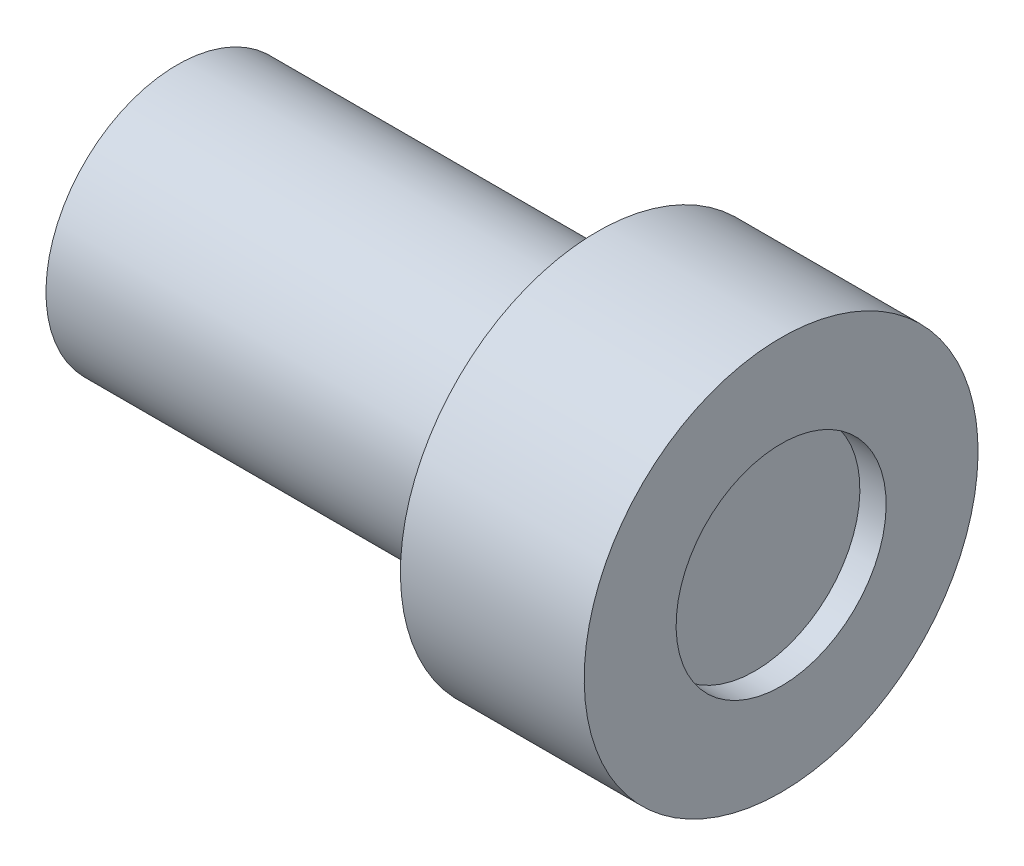
ISO-10303-21;
HEADER;
FILE_DESCRIPTION(('STEP AP214'),'2;1');
FILE_NAME('part.step','',(''),(''),'','','');
FILE_SCHEMA(('AUTOMOTIVE_DESIGN { 1 0 10303 214 1 1 1 1 }'));
ENDSEC;
DATA;
#1=APPLICATION_CONTEXT('core data for automotive mechanical design processes');
#2=APPLICATION_PROTOCOL_DEFINITION('international standard','automotive_design',2000,#1);
#3=PRODUCT_CONTEXT('',#1,'mechanical');
#4=PRODUCT('Part','Part','',(#3));
#5=PRODUCT_RELATED_PRODUCT_CATEGORY('part','',(#4));
#6=PRODUCT_DEFINITION_FORMATION('','',#4);
#7=PRODUCT_DEFINITION_CONTEXT('part definition',#1,'design');
#8=PRODUCT_DEFINITION('design','',#6,#7);
#9=PRODUCT_DEFINITION_SHAPE('','',#8);
#10=(LENGTH_UNIT() NAMED_UNIT(*) SI_UNIT(.MILLI.,.METRE.));
#11=(NAMED_UNIT(*) PLANE_ANGLE_UNIT() SI_UNIT($,.RADIAN.));
#12=(NAMED_UNIT(*) SI_UNIT($,.STERADIAN.) SOLID_ANGLE_UNIT());
#13=UNCERTAINTY_MEASURE_WITH_UNIT(LENGTH_MEASURE(1.E-05),#10,'distance_accuracy_value','');
#14=(GEOMETRIC_REPRESENTATION_CONTEXT(3) GLOBAL_UNCERTAINTY_ASSIGNED_CONTEXT((#13)) GLOBAL_UNIT_ASSIGNED_CONTEXT((#10,
#11,#12)) REPRESENTATION_CONTEXT('',''));
#15=CARTESIAN_POINT('',(0.,0.,0.));
#16=DIRECTION('',(0.,0.,1.));
#17=DIRECTION('',(1.,0.,0.));
#18=AXIS2_PLACEMENT_3D('',#15,#16,#17);
#19=CARTESIAN_POINT('',(-5.5,0.,0.));
#20=DIRECTION('',(-1.,0.,0.));
#21=DIRECTION('',(0.,-1.,0.));
#22=AXIS2_PLACEMENT_3D('',#19,#20,#21);
#23=PLANE('',#22);
#24=DIRECTION('',(0.,-1.,0.));
#25=VECTOR('',#24,1.);
#26=CARTESIAN_POINT('',(-5.5,1.15,-0.66395280956807));
#27=LINE('',#26,#25);
#28=CARTESIAN_POINT('',(-5.5,1.15,-0.66395280956807));
#29=VERTEX_POINT('',#28);
#30=CARTESIAN_POINT('',(-5.5,0.599999999999998,-0.66395280956807));
#31=VERTEX_POINT('',#30);
#32=EDGE_CURVE('E126',#29,#31,#27,.T.);
#33=ORIENTED_EDGE('',*,*,#32,.F.);
#34=DIRECTION('',(0.,0.5,-0.866025403784439));
#35=VECTOR('',#34,1.);
#36=CARTESIAN_POINT('',(-5.5,0.,1.32790561913614));
#37=LINE('',#36,#35);
#38=CARTESIAN_POINT('',(-5.5,0.,1.32790561913614));
#39=VERTEX_POINT('',#38);
#40=EDGE_CURVE('E137',#39,#29,#37,.T.);
#41=ORIENTED_EDGE('',*,*,#40,.F.);
#42=DIRECTION('',(0.,0.5,0.866025403784439));
#43=VECTOR('',#42,1.);
#44=CARTESIAN_POINT('',(-5.5,-1.15,-0.66395280956807));
#45=LINE('',#44,#43);
#46=CARTESIAN_POINT('',(-5.5,-1.15,-0.66395280956807));
#47=VERTEX_POINT('',#46);
#48=EDGE_CURVE('E144',#47,#39,#45,.T.);
#49=ORIENTED_EDGE('',*,*,#48,.F.);
#50=CARTESIAN_POINT('',(-5.5,-0.600000000000002,-0.66395280956807));
#51=VERTEX_POINT('',#50);
#52=EDGE_CURVE('E150',#51,#47,#27,.T.);
#53=ORIENTED_EDGE('',*,*,#52,.F.);
#54=DIRECTION('',(0.,0.,-1.));
#55=VECTOR('',#54,1.);
#56=CARTESIAN_POINT('',(-5.5,-0.600000000000002,0.));
#57=LINE('',#56,#55);
#58=CARTESIAN_POINT('',(-5.5,-0.600000000000002,-1.86395280956807));
#59=VERTEX_POINT('',#58);
#60=EDGE_CURVE('E83',#51,#59,#57,.T.);
#61=ORIENTED_EDGE('',*,*,#60,.T.);
#62=DIRECTION('',(0.,-1.,0.));
#63=VECTOR('',#62,1.);
#64=CARTESIAN_POINT('',(-5.5,0.,-1.86395280956807));
#65=LINE('',#64,#63);
#66=CARTESIAN_POINT('',(-5.5,0.599999999999998,-1.86395280956807));
#67=VERTEX_POINT('',#66);
#68=EDGE_CURVE('E363',#67,#59,#65,.T.);
#69=ORIENTED_EDGE('',*,*,#68,.F.);
#70=DIRECTION('',(0.,0.,-1.));
#71=VECTOR('',#70,1.);
#72=CARTESIAN_POINT('',(-5.5,0.599999999999999,0.));
#73=LINE('',#72,#71);
#74=EDGE_CURVE('E133',#31,#67,#73,.T.);
#75=ORIENTED_EDGE('',*,*,#74,.F.);
#76=EDGE_LOOP('',(#33,#41,#49,#53,#61,#69,#75));
#77=FACE_BOUND('',#76,.T.);
#78=CARTESIAN_POINT('',(-5.5,0.,0.));
#79=DIRECTION('',(-1.,0.,0.));
#80=DIRECTION('',(0.,-1.,0.));
#81=AXIS2_PLACEMENT_3D('',#78,#79,#80);
#82=CIRCLE('',#81,2.5);
#83=CARTESIAN_POINT('',(-5.5,-2.5,0.));
#84=VERTEX_POINT('',#83);
#85=EDGE_CURVE('E12',#84,#84,#82,.T.);
#86=ORIENTED_EDGE('',*,*,#85,.T.);
#87=EDGE_LOOP('',(#86));
#88=FACE_BOUND('',#87,.T.);
#89=ADVANCED_FACE('F68',(#77,#88),#23,.T.);
#90=CARTESIAN_POINT('',(-5.5,0.,0.));
#91=DIRECTION('',(-1.,0.,0.));
#92=DIRECTION('',(0.,-1.,0.));
#93=AXIS2_PLACEMENT_3D('',#90,#91,#92);
#94=CYLINDRICAL_SURFACE('',#93,2.5);
#95=CARTESIAN_POINT('',(2.5,0.,0.));
#96=DIRECTION('',(-1.,0.,0.));
#97=DIRECTION('',(0.,-1.,0.));
#98=AXIS2_PLACEMENT_3D('',#95,#96,#97);
#99=CIRCLE('',#98,2.5);
#100=CARTESIAN_POINT('',(2.5,-2.5,0.));
#101=VERTEX_POINT('',#100);
#102=EDGE_CURVE('E76',#101,#101,#99,.T.);
#103=ORIENTED_EDGE('',*,*,#102,.T.);
#104=EDGE_LOOP('',(#103));
#105=FACE_BOUND('',#104,.T.);
#106=ORIENTED_EDGE('',*,*,#85,.F.);
#107=EDGE_LOOP('',(#106));
#108=FACE_BOUND('',#107,.T.);
#109=ADVANCED_FACE('F184',(#105,#108),#94,.T.);
#110=CARTESIAN_POINT('',(2.5,-2.5,0.));
#111=DIRECTION('',(-1.,0.,0.));
#112=DIRECTION('',(0.,-1.,0.));
#113=AXIS2_PLACEMENT_3D('',#110,#111,#112);
#114=PLANE('',#113);
#115=CARTESIAN_POINT('',(2.5,0.,0.));
#116=DIRECTION('',(-1.,0.,0.));
#117=DIRECTION('',(0.,-1.,0.));
#118=AXIS2_PLACEMENT_3D('',#115,#116,#117);
#119=CIRCLE('',#118,3.75);
#120=CARTESIAN_POINT('',(2.5,-3.75,0.));
#121=VERTEX_POINT('',#120);
#122=EDGE_CURVE('E177',#121,#121,#119,.T.);
#123=ORIENTED_EDGE('',*,*,#122,.T.);
#124=EDGE_LOOP('',(#123));
#125=FACE_BOUND('',#124,.T.);
#126=ORIENTED_EDGE('',*,*,#102,.F.);
#127=EDGE_LOOP('',(#126));
#128=FACE_BOUND('',#127,.T.);
#129=ADVANCED_FACE('F187',(#125,#128),#114,.T.);
#130=CARTESIAN_POINT('',(-5.5,0.,0.));
#131=DIRECTION('',(-1.,0.,0.));
#132=DIRECTION('',(0.,-1.,0.));
#133=AXIS2_PLACEMENT_3D('',#130,#131,#132);
#134=CYLINDRICAL_SURFACE('',#133,3.75);
#135=CARTESIAN_POINT('',(6.,0.,0.));
#136=DIRECTION('',(-1.,0.,0.));
#137=DIRECTION('',(0.,-1.,0.));
#138=AXIS2_PLACEMENT_3D('',#135,#136,#137);
#139=CIRCLE('',#138,3.75);
#140=CARTESIAN_POINT('',(6.,-3.75,0.));
#141=VERTEX_POINT('',#140);
#142=EDGE_CURVE('E173',#141,#141,#139,.T.);
#143=ORIENTED_EDGE('',*,*,#142,.T.);
#144=EDGE_LOOP('',(#143));
#145=FACE_BOUND('',#144,.T.);
#146=ORIENTED_EDGE('',*,*,#122,.F.);
#147=EDGE_LOOP('',(#146));
#148=FACE_BOUND('',#147,.T.);
#149=ADVANCED_FACE('F189',(#145,#148),#134,.T.);
#150=CARTESIAN_POINT('',(6.,-3.75,0.));
#151=DIRECTION('',(1.,0.,0.));
#152=DIRECTION('',(0.,1.,0.));
#153=AXIS2_PLACEMENT_3D('',#150,#151,#152);
#154=PLANE('',#153);
#155=CARTESIAN_POINT('',(6.,0.,0.));
#156=DIRECTION('',(-1.,0.,0.));
#157=DIRECTION('',(0.,-1.,0.));
#158=AXIS2_PLACEMENT_3D('',#155,#156,#157);
#159=CIRCLE('',#158,2.);
#160=CARTESIAN_POINT('',(6.,-2.,0.));
#161=VERTEX_POINT('',#160);
#162=EDGE_CURVE('E169',#161,#161,#159,.T.);
#163=ORIENTED_EDGE('',*,*,#162,.T.);
#164=EDGE_LOOP('',(#163));
#165=FACE_BOUND('',#164,.T.);
#166=ORIENTED_EDGE('',*,*,#142,.F.);
#167=EDGE_LOOP('',(#166));
#168=FACE_BOUND('',#167,.T.);
#169=ADVANCED_FACE('F196',(#165,#168),#154,.T.);
#170=CARTESIAN_POINT('',(-5.5,0.,0.));
#171=DIRECTION('',(-1.,0.,0.));
#172=DIRECTION('',(0.,-1.,0.));
#173=AXIS2_PLACEMENT_3D('',#170,#171,#172);
#174=CYLINDRICAL_SURFACE('',#173,2.);
#175=CARTESIAN_POINT('',(5.5,0.,0.));
#176=DIRECTION('',(-1.,0.,0.));
#177=DIRECTION('',(0.,-1.,0.));
#178=AXIS2_PLACEMENT_3D('',#175,#176,#177);
#179=CIRCLE('',#178,2.);
#180=CARTESIAN_POINT('',(5.5,-2.,0.));
#181=VERTEX_POINT('',#180);
#182=EDGE_CURVE('E165',#181,#181,#179,.T.);
#183=ORIENTED_EDGE('',*,*,#182,.T.);
#184=EDGE_LOOP('',(#183));
#185=FACE_BOUND('',#184,.T.);
#186=ORIENTED_EDGE('',*,*,#162,.F.);
#187=EDGE_LOOP('',(#186));
#188=FACE_BOUND('',#187,.T.);
#189=ADVANCED_FACE('F288',(#185,#188),#174,.F.);
#190=CARTESIAN_POINT('',(5.5,-2.,0.));
#191=DIRECTION('',(1.,0.,0.));
#192=DIRECTION('',(0.,1.,0.));
#193=AXIS2_PLACEMENT_3D('',#190,#191,#192);
#194=PLANE('',#193);
#195=ORIENTED_EDGE('',*,*,#182,.F.);
#196=EDGE_LOOP('',(#195));
#197=FACE_BOUND('',#196,.T.);
#198=ADVANCED_FACE('F208',(#197),#194,.T.);
#199=CARTESIAN_POINT('',(-4.5,0.599999999999999,0.));
#200=DIRECTION('',(0.,1.,0.));
#201=DIRECTION('',(0.,0.,1.));
#202=AXIS2_PLACEMENT_3D('',#199,#200,#201);
#203=PLANE('',#202);
#204=ORIENTED_EDGE('',*,*,#74,.T.);
#205=DIRECTION('',(-1.,0.,0.));
#206=VECTOR('',#205,1.);
#207=CARTESIAN_POINT('',(-4.5,0.599999999999998,-1.86395280956807));
#208=LINE('',#207,#206);
#209=CARTESIAN_POINT('',(-4.5,0.599999999999998,-1.86395280956807));
#210=VERTEX_POINT('',#209);
#211=EDGE_CURVE('E352',#210,#67,#208,.T.);
#212=ORIENTED_EDGE('',*,*,#211,.F.);
#213=DIRECTION('',(0.,0.,-1.));
#214=VECTOR('',#213,1.);
#215=CARTESIAN_POINT('',(-4.5,0.599999999999999,0.));
#216=LINE('',#215,#214);
#217=CARTESIAN_POINT('',(-4.5,0.599999999999998,-0.66395280956807));
#218=VERTEX_POINT('',#217);
#219=EDGE_CURVE('E362',#218,#210,#216,.T.);
#220=ORIENTED_EDGE('',*,*,#219,.F.);
#221=DIRECTION('',(-1.,0.,0.));
#222=VECTOR('',#221,1.);
#223=CARTESIAN_POINT('',(-4.5,0.599999999999998,-0.66395280956807));
#224=LINE('',#223,#222);
#225=EDGE_CURVE('E92',#218,#31,#224,.T.);
#226=ORIENTED_EDGE('',*,*,#225,.T.);
#227=EDGE_LOOP('',(#204,#212,#220,#226));
#228=FACE_BOUND('',#227,.T.);
#229=ADVANCED_FACE('F212',(#228),#203,.F.);
#230=CARTESIAN_POINT('',(-4.5,-0.600000000000002,0.));
#231=DIRECTION('',(0.,1.,0.));
#232=DIRECTION('',(0.,0.,1.));
#233=AXIS2_PLACEMENT_3D('',#230,#231,#232);
#234=PLANE('',#233);
#235=ORIENTED_EDGE('',*,*,#60,.F.);
#236=DIRECTION('',(-1.,0.,0.));
#237=VECTOR('',#236,1.);
#238=CARTESIAN_POINT('',(-4.5,-0.600000000000002,-0.66395280956807));
#239=LINE('',#238,#237);
#240=CARTESIAN_POINT('',(-4.5,-0.600000000000002,-0.66395280956807));
#241=VERTEX_POINT('',#240);
#242=EDGE_CURVE('E336',#241,#51,#239,.T.);
#243=ORIENTED_EDGE('',*,*,#242,.F.);
#244=DIRECTION('',(0.,0.,-1.));
#245=VECTOR('',#244,1.);
#246=CARTESIAN_POINT('',(-4.5,-0.600000000000002,0.));
#247=LINE('',#246,#245);
#248=CARTESIAN_POINT('',(-4.5,-0.600000000000002,-1.86395280956807));
#249=VERTEX_POINT('',#248);
#250=EDGE_CURVE('E355',#241,#249,#247,.T.);
#251=ORIENTED_EDGE('',*,*,#250,.T.);
#252=DIRECTION('',(-1.,0.,0.));
#253=VECTOR('',#252,1.);
#254=CARTESIAN_POINT('',(-4.5,-0.600000000000002,-1.86395280956807));
#255=LINE('',#254,#253);
#256=EDGE_CURVE('E342',#249,#59,#255,.T.);
#257=ORIENTED_EDGE('',*,*,#256,.T.);
#258=EDGE_LOOP('',(#235,#243,#251,#257));
#259=FACE_BOUND('',#258,.T.);
#260=ADVANCED_FACE('F216',(#259),#234,.T.);
#261=CARTESIAN_POINT('',(-4.5,0.,-1.86395280956807));
#262=DIRECTION('',(0.,0.,-1.));
#263=DIRECTION('',(0.,1.,0.));
#264=AXIS2_PLACEMENT_3D('',#261,#262,#263);
#265=PLANE('',#264);
#266=ORIENTED_EDGE('',*,*,#68,.T.);
#267=ORIENTED_EDGE('',*,*,#256,.F.);
#268=DIRECTION('',(0.,-1.,0.));
#269=VECTOR('',#268,1.);
#270=CARTESIAN_POINT('',(-4.5,0.,-1.86395280956807));
#271=LINE('',#270,#269);
#272=EDGE_CURVE('E371',#210,#249,#271,.T.);
#273=ORIENTED_EDGE('',*,*,#272,.F.);
#274=ORIENTED_EDGE('',*,*,#211,.T.);
#275=EDGE_LOOP('',(#266,#267,#273,#274));
#276=FACE_BOUND('',#275,.T.);
#277=ADVANCED_FACE('F226',(#276),#265,.F.);
#278=CARTESIAN_POINT('',(-4.5,0.,0.));
#279=DIRECTION('',(-1.,0.,0.));
#280=DIRECTION('',(0.,0.,1.));
#281=AXIS2_PLACEMENT_3D('',#278,#279,#280);
#282=PLANE('',#281);
#283=ORIENTED_EDGE('',*,*,#219,.T.);
#284=ORIENTED_EDGE('',*,*,#272,.T.);
#285=ORIENTED_EDGE('',*,*,#250,.F.);
#286=DIRECTION('',(0.,-1.,0.));
#287=VECTOR('',#286,1.);
#288=CARTESIAN_POINT('',(-4.5,1.15,-0.66395280956807));
#289=LINE('',#288,#287);
#290=CARTESIAN_POINT('',(-4.5,-1.15,-0.66395280956807));
#291=VERTEX_POINT('',#290);
#292=EDGE_CURVE('E143',#241,#291,#289,.T.);
#293=ORIENTED_EDGE('',*,*,#292,.T.);
#294=DIRECTION('',(0.,0.5,0.866025403784439));
#295=VECTOR('',#294,1.);
#296=CARTESIAN_POINT('',(-4.5,-1.15,-0.66395280956807));
#297=LINE('',#296,#295);
#298=CARTESIAN_POINT('',(-4.5,0.,1.32790561913614));
#299=VERTEX_POINT('',#298);
#300=EDGE_CURVE('E346',#291,#299,#297,.T.);
#301=ORIENTED_EDGE('',*,*,#300,.T.);
#302=DIRECTION('',(0.,0.5,-0.866025403784439));
#303=VECTOR('',#302,1.);
#304=CARTESIAN_POINT('',(-4.5,0.,1.32790561913614));
#305=LINE('',#304,#303);
#306=CARTESIAN_POINT('',(-4.5,1.15,-0.66395280956807));
#307=VERTEX_POINT('',#306);
#308=EDGE_CURVE('E156',#299,#307,#305,.T.);
#309=ORIENTED_EDGE('',*,*,#308,.T.);
#310=EDGE_CURVE('E128',#307,#218,#289,.T.);
#311=ORIENTED_EDGE('',*,*,#310,.T.);
#312=EDGE_LOOP('',(#283,#284,#285,#293,#301,#309,#311));
#313=FACE_BOUND('',#312,.T.);
#314=ADVANCED_FACE('F234',(#313),#282,.T.);
#315=CARTESIAN_POINT('',(-4.5,-1.15,-0.66395280956807));
#316=DIRECTION('',(0.,-0.866025403784439,0.5));
#317=DIRECTION('',(0.,-0.5,-0.866025403784439));
#318=AXIS2_PLACEMENT_3D('',#315,#316,#317);
#319=PLANE('',#318);
#320=ORIENTED_EDGE('',*,*,#48,.T.);
#321=DIRECTION('',(-1.,0.,0.));
#322=VECTOR('',#321,1.);
#323=CARTESIAN_POINT('',(-4.5,0.,1.32790561913614));
#324=LINE('',#323,#322);
#325=EDGE_CURVE('E134',#299,#39,#324,.T.);
#326=ORIENTED_EDGE('',*,*,#325,.F.);
#327=ORIENTED_EDGE('',*,*,#300,.F.);
#328=DIRECTION('',(-1.,0.,0.));
#329=VECTOR('',#328,1.);
#330=CARTESIAN_POINT('',(-4.5,-1.15,-0.66395280956807));
#331=LINE('',#330,#329);
#332=EDGE_CURVE('E161',#291,#47,#331,.T.);
#333=ORIENTED_EDGE('',*,*,#332,.T.);
#334=EDGE_LOOP('',(#320,#326,#327,#333));
#335=FACE_BOUND('',#334,.T.);
#336=ADVANCED_FACE('F219',(#335),#319,.F.);
#337=CARTESIAN_POINT('',(-4.5,0.,1.32790561913614));
#338=DIRECTION('',(0.,0.866025403784439,0.5));
#339=DIRECTION('',(0.,-0.5,0.866025403784439));
#340=AXIS2_PLACEMENT_3D('',#337,#338,#339);
#341=PLANE('',#340);
#342=ORIENTED_EDGE('',*,*,#40,.T.);
#343=DIRECTION('',(-1.,0.,0.));
#344=VECTOR('',#343,1.);
#345=CARTESIAN_POINT('',(-4.5,1.15,-0.66395280956807));
#346=LINE('',#345,#344);
#347=EDGE_CURVE('E122',#307,#29,#346,.T.);
#348=ORIENTED_EDGE('',*,*,#347,.F.);
#349=ORIENTED_EDGE('',*,*,#308,.F.);
#350=ORIENTED_EDGE('',*,*,#325,.T.);
#351=EDGE_LOOP('',(#342,#348,#349,#350));
#352=FACE_BOUND('',#351,.T.);
#353=ADVANCED_FACE('F138',(#352),#341,.F.);
#354=CARTESIAN_POINT('',(-4.5,1.15,-0.66395280956807));
#355=DIRECTION('',(0.,0.,-1.));
#356=DIRECTION('',(0.,1.,0.));
#357=AXIS2_PLACEMENT_3D('',#354,#355,#356);
#358=PLANE('',#357);
#359=ORIENTED_EDGE('',*,*,#310,.F.);
#360=ORIENTED_EDGE('',*,*,#347,.T.);
#361=ORIENTED_EDGE('',*,*,#32,.T.);
#362=ORIENTED_EDGE('',*,*,#225,.F.);
#363=EDGE_LOOP('',(#359,#360,#361,#362));
#364=FACE_BOUND('',#363,.T.);
#365=ADVANCED_FACE('F124',(#364),#358,.F.);
#366=ORIENTED_EDGE('',*,*,#242,.T.);
#367=ORIENTED_EDGE('',*,*,#52,.T.);
#368=ORIENTED_EDGE('',*,*,#332,.F.);
#369=ORIENTED_EDGE('',*,*,#292,.F.);
#370=EDGE_LOOP('',(#366,#367,#368,#369));
#371=FACE_BOUND('',#370,.T.);
#372=ADVANCED_FACE('F266',(#371),#358,.F.);
#373=CLOSED_SHELL('',(#89,#109,#129,#149,#169,#189,#198,#229,#260,#277,#314,#336,#353,#365,#372));
#374=MANIFOLD_SOLID_BREP('B2',#373);
#375=ADVANCED_BREP_SHAPE_REPRESENTATION('',(#18,#374),#14);
#376=SHAPE_DEFINITION_REPRESENTATION(#9,#375);
ENDSEC;
END-ISO-10303-21;
